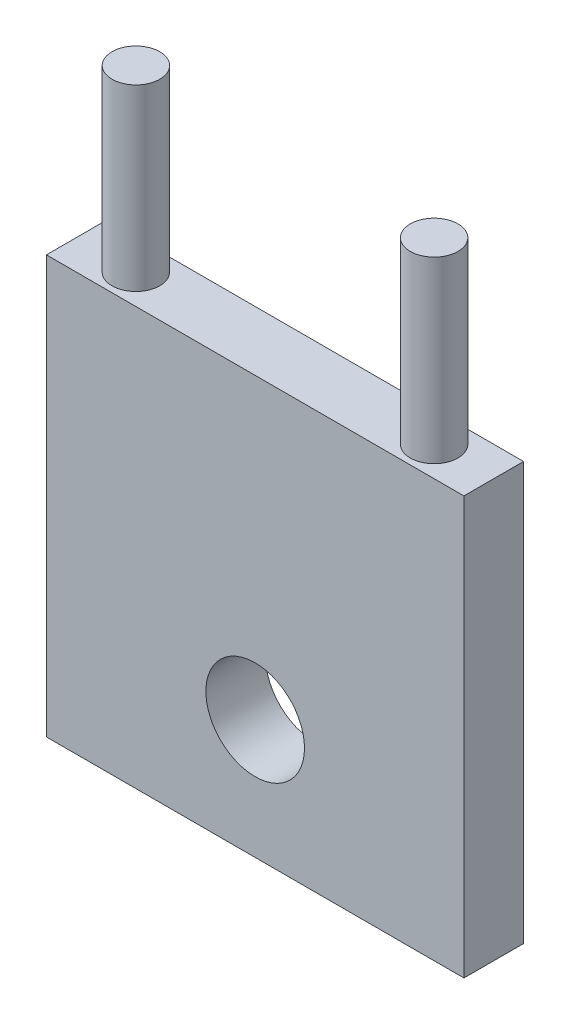
ISO-10303-21;
HEADER;
FILE_DESCRIPTION(('STEP AP214'),'2;1');
FILE_NAME('part.step','',(''),(''),'','','');
FILE_SCHEMA(('AUTOMOTIVE_DESIGN { 1 0 10303 214 1 1 1 1 }'));
ENDSEC;
DATA;
#1=APPLICATION_CONTEXT('core data for automotive mechanical design processes');
#2=APPLICATION_PROTOCOL_DEFINITION('international standard','automotive_design',2000,#1);
#3=PRODUCT_CONTEXT('',#1,'mechanical');
#4=PRODUCT('Part','Part','',(#3));
#5=PRODUCT_RELATED_PRODUCT_CATEGORY('part','',(#4));
#6=PRODUCT_DEFINITION_FORMATION('','',#4);
#7=PRODUCT_DEFINITION_CONTEXT('part definition',#1,'design');
#8=PRODUCT_DEFINITION('design','',#6,#7);
#9=PRODUCT_DEFINITION_SHAPE('','',#8);
#10=(LENGTH_UNIT() NAMED_UNIT(*) SI_UNIT(.MILLI.,.METRE.));
#11=(NAMED_UNIT(*) PLANE_ANGLE_UNIT() SI_UNIT($,.RADIAN.));
#12=(NAMED_UNIT(*) SI_UNIT($,.STERADIAN.) SOLID_ANGLE_UNIT());
#13=UNCERTAINTY_MEASURE_WITH_UNIT(LENGTH_MEASURE(1.E-05),#10,'distance_accuracy_value','');
#14=(GEOMETRIC_REPRESENTATION_CONTEXT(3) GLOBAL_UNCERTAINTY_ASSIGNED_CONTEXT((#13)) GLOBAL_UNIT_ASSIGNED_CONTEXT((#10,
#11,#12)) REPRESENTATION_CONTEXT('',''));
#15=CARTESIAN_POINT('',(0.,0.,0.));
#16=DIRECTION('',(0.,0.,1.));
#17=DIRECTION('',(1.,0.,0.));
#18=AXIS2_PLACEMENT_3D('',#15,#16,#17);
#19=CARTESIAN_POINT('',(17.78,0.,-2.54));
#20=DIRECTION('',(0.,-1.,0.));
#21=DIRECTION('',(1.,0.,0.));
#22=AXIS2_PLACEMENT_3D('',#19,#20,#21);
#23=PLANE('',#22);
#24=DIRECTION('',(1.,0.,0.));
#25=VECTOR('',#24,1.);
#26=CARTESIAN_POINT('',(17.78,0.,0.));
#27=LINE('',#26,#25);
#28=CARTESIAN_POINT('',(0.,0.,0.));
#29=VERTEX_POINT('',#28);
#30=CARTESIAN_POINT('',(17.78,0.,0.));
#31=VERTEX_POINT('',#30);
#32=EDGE_CURVE('E98',#29,#31,#27,.T.);
#33=ORIENTED_EDGE('',*,*,#32,.F.);
#34=DIRECTION('',(0.,0.,1.));
#35=VECTOR('',#34,1.);
#36=CARTESIAN_POINT('',(0.,0.,-2.54));
#37=LINE('',#36,#35);
#38=CARTESIAN_POINT('',(0.,0.,-2.54));
#39=VERTEX_POINT('',#38);
#40=EDGE_CURVE('E11',#39,#29,#37,.T.);
#41=ORIENTED_EDGE('',*,*,#40,.F.);
#42=DIRECTION('',(1.,0.,0.));
#43=VECTOR('',#42,1.);
#44=CARTESIAN_POINT('',(17.78,0.,-2.54));
#45=LINE('',#44,#43);
#46=CARTESIAN_POINT('',(17.78,0.,-2.54));
#47=VERTEX_POINT('',#46);
#48=EDGE_CURVE('E91',#39,#47,#45,.T.);
#49=ORIENTED_EDGE('',*,*,#48,.T.);
#50=DIRECTION('',(0.,0.,1.));
#51=VECTOR('',#50,1.);
#52=CARTESIAN_POINT('',(17.78,0.,-2.54));
#53=LINE('',#52,#51);
#54=EDGE_CURVE('E36',#47,#31,#53,.T.);
#55=ORIENTED_EDGE('',*,*,#54,.T.);
#56=EDGE_LOOP('',(#33,#41,#49,#55));
#57=FACE_BOUND('',#56,.T.);
#58=ADVANCED_FACE('F33',(#57),#23,.T.);
#59=CARTESIAN_POINT('',(0.,0.,-2.54));
#60=DIRECTION('',(-1.,0.,0.));
#61=DIRECTION('',(0.,0.,1.));
#62=AXIS2_PLACEMENT_3D('',#59,#60,#61);
#63=PLANE('',#62);
#64=DIRECTION('',(0.,-1.,0.));
#65=VECTOR('',#64,1.);
#66=CARTESIAN_POINT('',(0.,0.,0.));
#67=LINE('',#66,#65);
#68=CARTESIAN_POINT('',(0.,17.78,0.));
#69=VERTEX_POINT('',#68);
#70=EDGE_CURVE('E93',#69,#29,#67,.T.);
#71=ORIENTED_EDGE('',*,*,#70,.F.);
#72=DIRECTION('',(0.,0.,1.));
#73=VECTOR('',#72,1.);
#74=CARTESIAN_POINT('',(0.,17.78,-2.54));
#75=LINE('',#74,#73);
#76=CARTESIAN_POINT('',(0.,17.78,-2.54));
#77=VERTEX_POINT('',#76);
#78=EDGE_CURVE('E42',#77,#69,#75,.T.);
#79=ORIENTED_EDGE('',*,*,#78,.F.);
#80=DIRECTION('',(0.,-1.,0.));
#81=VECTOR('',#80,1.);
#82=CARTESIAN_POINT('',(0.,0.,-2.54));
#83=LINE('',#82,#81);
#84=EDGE_CURVE('E88',#77,#39,#83,.T.);
#85=ORIENTED_EDGE('',*,*,#84,.T.);
#86=ORIENTED_EDGE('',*,*,#40,.T.);
#87=EDGE_LOOP('',(#71,#79,#85,#86));
#88=FACE_BOUND('',#87,.T.);
#89=ADVANCED_FACE('F109',(#88),#63,.T.);
#90=CARTESIAN_POINT('',(0.,17.78,-2.54));
#91=DIRECTION('',(0.,1.,0.));
#92=DIRECTION('',(0.,0.,1.));
#93=AXIS2_PLACEMENT_3D('',#90,#91,#92);
#94=PLANE('',#93);
#95=CARTESIAN_POINT('',(15.24,17.78,-1.27));
#96=DIRECTION('',(0.,1.,0.));
#97=DIRECTION('',(0.,0.,1.));
#98=AXIS2_PLACEMENT_3D('',#95,#96,#97);
#99=CIRCLE('',#98,1.016);
#100=CARTESIAN_POINT('',(15.24,17.78,-2.286));
#101=VERTEX_POINT('',#100);
#102=EDGE_CURVE('E156',#101,#101,#99,.T.);
#103=ORIENTED_EDGE('',*,*,#102,.F.);
#104=EDGE_LOOP('',(#103));
#105=FACE_BOUND('',#104,.T.);
#106=CARTESIAN_POINT('',(2.54,17.78,-1.27));
#107=DIRECTION('',(0.,1.,0.));
#108=DIRECTION('',(0.,0.,1.));
#109=AXIS2_PLACEMENT_3D('',#106,#107,#108);
#110=CIRCLE('',#109,1.016);
#111=CARTESIAN_POINT('',(2.54,17.78,-2.286));
#112=VERTEX_POINT('',#111);
#113=EDGE_CURVE('E155',#112,#112,#110,.T.);
#114=ORIENTED_EDGE('',*,*,#113,.F.);
#115=EDGE_LOOP('',(#114));
#116=FACE_BOUND('',#115,.T.);
#117=DIRECTION('',(-1.,0.,0.));
#118=VECTOR('',#117,1.);
#119=CARTESIAN_POINT('',(0.,17.78,0.));
#120=LINE('',#119,#118);
#121=CARTESIAN_POINT('',(17.78,17.78,0.));
#122=VERTEX_POINT('',#121);
#123=EDGE_CURVE('E83',#122,#69,#120,.T.);
#124=ORIENTED_EDGE('',*,*,#123,.F.);
#125=DIRECTION('',(0.,0.,1.));
#126=VECTOR('',#125,1.);
#127=CARTESIAN_POINT('',(17.78,17.78,-2.54));
#128=LINE('',#127,#126);
#129=CARTESIAN_POINT('',(17.78,17.78,-2.54));
#130=VERTEX_POINT('',#129);
#131=EDGE_CURVE('E78',#130,#122,#128,.T.);
#132=ORIENTED_EDGE('',*,*,#131,.F.);
#133=DIRECTION('',(-1.,0.,0.));
#134=VECTOR('',#133,1.);
#135=CARTESIAN_POINT('',(0.,17.78,-2.54));
#136=LINE('',#135,#134);
#137=EDGE_CURVE('E81',#130,#77,#136,.T.);
#138=ORIENTED_EDGE('',*,*,#137,.T.);
#139=ORIENTED_EDGE('',*,*,#78,.T.);
#140=EDGE_LOOP('',(#124,#132,#138,#139));
#141=FACE_BOUND('',#140,.T.);
#142=ADVANCED_FACE('F80',(#105,#116,#141),#94,.T.);
#143=CARTESIAN_POINT('',(17.78,17.78,-2.54));
#144=DIRECTION('',(1.,0.,0.));
#145=DIRECTION('',(0.,1.,0.));
#146=AXIS2_PLACEMENT_3D('',#143,#144,#145);
#147=PLANE('',#146);
#148=DIRECTION('',(0.,1.,0.));
#149=VECTOR('',#148,1.);
#150=CARTESIAN_POINT('',(17.78,17.78,0.));
#151=LINE('',#150,#149);
#152=EDGE_CURVE('E101',#31,#122,#151,.T.);
#153=ORIENTED_EDGE('',*,*,#152,.F.);
#154=ORIENTED_EDGE('',*,*,#54,.F.);
#155=DIRECTION('',(0.,1.,0.));
#156=VECTOR('',#155,1.);
#157=CARTESIAN_POINT('',(17.78,17.78,-2.54));
#158=LINE('',#157,#156);
#159=EDGE_CURVE('E87',#47,#130,#158,.T.);
#160=ORIENTED_EDGE('',*,*,#159,.T.);
#161=ORIENTED_EDGE('',*,*,#131,.T.);
#162=EDGE_LOOP('',(#153,#154,#160,#161));
#163=FACE_BOUND('',#162,.T.);
#164=ADVANCED_FACE('F90',(#163),#147,.T.);
#165=CARTESIAN_POINT('',(0.,0.,-2.54));
#166=DIRECTION('',(0.,0.,-1.));
#167=DIRECTION('',(-1.,0.,0.));
#168=AXIS2_PLACEMENT_3D('',#165,#166,#167);
#169=PLANE('',#168);
#170=CARTESIAN_POINT('',(8.89,5.08,-2.54));
#171=DIRECTION('',(0.,0.,1.));
#172=DIRECTION('',(1.,0.,0.));
#173=AXIS2_PLACEMENT_3D('',#170,#171,#172);
#174=CIRCLE('',#173,2.0999958);
#175=CARTESIAN_POINT('',(10.9899958,5.08,-2.54));
#176=VERTEX_POINT('',#175);
#177=EDGE_CURVE('E102',#176,#176,#174,.T.);
#178=ORIENTED_EDGE('',*,*,#177,.T.);
#179=EDGE_LOOP('',(#178));
#180=FACE_BOUND('',#179,.T.);
#181=ORIENTED_EDGE('',*,*,#48,.F.);
#182=ORIENTED_EDGE('',*,*,#84,.F.);
#183=ORIENTED_EDGE('',*,*,#137,.F.);
#184=ORIENTED_EDGE('',*,*,#159,.F.);
#185=EDGE_LOOP('',(#181,#182,#183,#184));
#186=FACE_BOUND('',#185,.T.);
#187=ADVANCED_FACE('F86',(#180,#186),#169,.T.);
#188=CARTESIAN_POINT('',(0.,0.,0.));
#189=DIRECTION('',(0.,0.,-1.));
#190=DIRECTION('',(-1.,0.,0.));
#191=AXIS2_PLACEMENT_3D('',#188,#189,#190);
#192=PLANE('',#191);
#193=CARTESIAN_POINT('',(8.89,5.08,0.));
#194=DIRECTION('',(0.,0.,1.));
#195=DIRECTION('',(1.,0.,0.));
#196=AXIS2_PLACEMENT_3D('',#193,#194,#195);
#197=CIRCLE('',#196,2.0999958);
#198=CARTESIAN_POINT('',(10.9899958,5.08,0.));
#199=VERTEX_POINT('',#198);
#200=EDGE_CURVE('E165',#199,#199,#197,.T.);
#201=ORIENTED_EDGE('',*,*,#200,.F.);
#202=EDGE_LOOP('',(#201));
#203=FACE_BOUND('',#202,.T.);
#204=ORIENTED_EDGE('',*,*,#32,.T.);
#205=ORIENTED_EDGE('',*,*,#152,.T.);
#206=ORIENTED_EDGE('',*,*,#123,.T.);
#207=ORIENTED_EDGE('',*,*,#70,.T.);
#208=EDGE_LOOP('',(#204,#205,#206,#207));
#209=FACE_BOUND('',#208,.T.);
#210=ADVANCED_FACE('F108',(#203,#209),#192,.F.);
#211=CARTESIAN_POINT('',(8.89,5.08,-2.54));
#212=DIRECTION('',(0.,0.,1.));
#213=DIRECTION('',(1.,0.,0.));
#214=AXIS2_PLACEMENT_3D('',#211,#212,#213);
#215=CYLINDRICAL_SURFACE('',#214,2.0999958);
#216=ORIENTED_EDGE('',*,*,#177,.F.);
#217=EDGE_LOOP('',(#216));
#218=FACE_BOUND('',#217,.T.);
#219=ORIENTED_EDGE('',*,*,#200,.T.);
#220=EDGE_LOOP('',(#219));
#221=FACE_BOUND('',#220,.T.);
#222=ADVANCED_FACE('F128',(#218,#221),#215,.F.);
#223=CARTESIAN_POINT('',(2.54,25.4,-1.27));
#224=DIRECTION('',(0.,-1.,0.));
#225=DIRECTION('',(0.,0.,-1.));
#226=AXIS2_PLACEMENT_3D('',#223,#224,#225);
#227=CYLINDRICAL_SURFACE('',#226,1.016);
#228=CARTESIAN_POINT('',(2.54,25.4,-1.27));
#229=DIRECTION('',(0.,1.,0.));
#230=DIRECTION('',(0.,0.,1.));
#231=AXIS2_PLACEMENT_3D('',#228,#229,#230);
#232=CIRCLE('',#231,1.016);
#233=CARTESIAN_POINT('',(2.54,25.4,-2.286));
#234=VERTEX_POINT('',#233);
#235=EDGE_CURVE('E159',#234,#234,#232,.T.);
#236=CARTESIAN_POINT('',(2.54,25.4,-2.286));
#237=CARTESIAN_POINT('',(2.54,25.320625,-2.286));
#238=CARTESIAN_POINT('',(2.54,25.24125,-2.286));
#239=CARTESIAN_POINT('',(2.54,25.0825,-2.286));
#240=CARTESIAN_POINT('',(2.54,25.003125,-2.286));
#241=CARTESIAN_POINT('',(2.54,24.844375,-2.286));
#242=CARTESIAN_POINT('',(2.54,24.765,-2.286));
#243=CARTESIAN_POINT('',(2.54,24.60625,-2.286));
#244=CARTESIAN_POINT('',(2.54,24.526875,-2.286));
#245=CARTESIAN_POINT('',(2.54,24.368125,-2.286));
#246=CARTESIAN_POINT('',(2.54,24.28875,-2.286));
#247=CARTESIAN_POINT('',(2.54,24.13,-2.286));
#248=CARTESIAN_POINT('',(2.54,24.050625,-2.286));
#249=CARTESIAN_POINT('',(2.54,23.891875,-2.286));
#250=CARTESIAN_POINT('',(2.54,23.8125,-2.286));
#251=CARTESIAN_POINT('',(2.54,23.65375,-2.286));
#252=CARTESIAN_POINT('',(2.54,23.574375,-2.286));
#253=CARTESIAN_POINT('',(2.54,23.415625,-2.286));
#254=CARTESIAN_POINT('',(2.54,23.33625,-2.286));
#255=CARTESIAN_POINT('',(2.54,23.1775,-2.286));
#256=CARTESIAN_POINT('',(2.54,23.098125,-2.286));
#257=CARTESIAN_POINT('',(2.54,22.939375,-2.286));
#258=CARTESIAN_POINT('',(2.54,22.86,-2.286));
#259=CARTESIAN_POINT('',(2.54,22.70125,-2.286));
#260=CARTESIAN_POINT('',(2.54,22.621875,-2.286));
#261=CARTESIAN_POINT('',(2.54,22.463125,-2.286));
#262=CARTESIAN_POINT('',(2.54,22.38375,-2.286));
#263=CARTESIAN_POINT('',(2.54,22.225,-2.286));
#264=CARTESIAN_POINT('',(2.54,22.145625,-2.286));
#265=CARTESIAN_POINT('',(2.54,21.986875,-2.286));
#266=CARTESIAN_POINT('',(2.54,21.9075,-2.286));
#267=CARTESIAN_POINT('',(2.54,21.74875,-2.286));
#268=CARTESIAN_POINT('',(2.54,21.669375,-2.286));
#269=CARTESIAN_POINT('',(2.54,21.510625,-2.286));
#270=CARTESIAN_POINT('',(2.54,21.43125,-2.286));
#271=CARTESIAN_POINT('',(2.54,21.2725,-2.286));
#272=CARTESIAN_POINT('',(2.54,21.193125,-2.286));
#273=CARTESIAN_POINT('',(2.54,21.034375,-2.286));
#274=CARTESIAN_POINT('',(2.54,20.955,-2.286));
#275=CARTESIAN_POINT('',(2.54,20.79625,-2.286));
#276=CARTESIAN_POINT('',(2.54,20.716875,-2.286));
#277=CARTESIAN_POINT('',(2.54,20.558125,-2.286));
#278=CARTESIAN_POINT('',(2.54,20.47875,-2.286));
#279=CARTESIAN_POINT('',(2.54,20.32,-2.286));
#280=CARTESIAN_POINT('',(2.54,20.240625,-2.286));
#281=CARTESIAN_POINT('',(2.54,20.081875,-2.286));
#282=CARTESIAN_POINT('',(2.54,20.0025,-2.286));
#283=CARTESIAN_POINT('',(2.54,19.84375,-2.286));
#284=CARTESIAN_POINT('',(2.54,19.764375,-2.286));
#285=CARTESIAN_POINT('',(2.54,19.605625,-2.286));
#286=CARTESIAN_POINT('',(2.54,19.52625,-2.286));
#287=CARTESIAN_POINT('',(2.54,19.3675,-2.286));
#288=CARTESIAN_POINT('',(2.54,19.288125,-2.286));
#289=CARTESIAN_POINT('',(2.54,19.129375,-2.286));
#290=CARTESIAN_POINT('',(2.54,19.05,-2.286));
#291=CARTESIAN_POINT('',(2.54,18.89125,-2.286));
#292=CARTESIAN_POINT('',(2.54,18.811875,-2.286));
#293=CARTESIAN_POINT('',(2.54,18.653125,-2.286));
#294=CARTESIAN_POINT('',(2.54,18.57375,-2.286));
#295=CARTESIAN_POINT('',(2.54,18.415,-2.286));
#296=CARTESIAN_POINT('',(2.54,18.335625,-2.286));
#297=CARTESIAN_POINT('',(2.54,18.176875,-2.286));
#298=CARTESIAN_POINT('',(2.54,18.0975,-2.286));
#299=CARTESIAN_POINT('',(2.54,17.93875,-2.286));
#300=CARTESIAN_POINT('',(2.54,17.859375,-2.286));
#301=CARTESIAN_POINT('',(2.54,17.78,-2.286));
#302=B_SPLINE_CURVE_WITH_KNOTS('',3,(#236,#237,#238,#239,#240,#241,#242,#243,#244,#245,#246,
#247,#248,#249,#250,#251,#252,#253,#254,#255,#256,#257,#258,#259,#260,#261,#262,#263,#264,#265,
#266,#267,#268,#269,#270,#271,#272,#273,#274,#275,#276,#277,#278,#279,#280,#281,#282,#283,#284,
#285,#286,#287,#288,#289,#290,#291,#292,#293,#294,#295,#296,#297,#298,#299,#300,#301),
.UNSPECIFIED.,.F.,.F.,(4,2,2,2,2,2,2,2,2,2,2,2,2,2,2,2,2,2,2,2,2,2,2,2,2,2,2,2,2,2,2,2,4),(0.,
0.238125000000002,0.476250000000001,0.714375000000003,0.952500000000002,1.190625,1.42875,
1.666875,1.905,2.143125,2.38125,2.619375,2.8575,3.095625,3.33375,3.571875,3.81,4.048125,4.28625,
4.524375,4.7625,5.000625,5.23875,5.476875,5.715,5.953125,6.19125,6.429375,6.6675,6.905625,
7.14375,7.381875,7.62),.UNSPECIFIED.);
#303=EDGE_CURVE('BSEAM134',#234,#112,#302,.T.);
#304=ORIENTED_EDGE('',*,*,#235,.F.);
#305=ORIENTED_EDGE('',*,*,#113,.T.);
#306=ORIENTED_EDGE('',*,*,#303,.T.);
#307=ORIENTED_EDGE('',*,*,#303,.F.);
#308=EDGE_LOOP('',(#304,#306,#305,#307));
#309=FACE_BOUND('',#308,.T.);
#310=ADVANCED_FACE('F134',(#309),#227,.T.);
#311=CARTESIAN_POINT('',(2.54,25.4,-1.27));
#312=DIRECTION('',(0.,1.,0.));
#313=DIRECTION('',(0.,0.,1.));
#314=AXIS2_PLACEMENT_3D('',#311,#312,#313);
#315=PLANE('',#314);
#316=ORIENTED_EDGE('',*,*,#235,.T.);
#317=EDGE_LOOP('',(#316));
#318=FACE_BOUND('',#317,.T.);
#319=ADVANCED_FACE('F138',(#318),#315,.T.);
#320=CARTESIAN_POINT('',(15.24,25.4,-1.27));
#321=DIRECTION('',(0.,-1.,0.));
#322=DIRECTION('',(0.,0.,-1.));
#323=AXIS2_PLACEMENT_3D('',#320,#321,#322);
#324=CYLINDRICAL_SURFACE('',#323,1.016);
#325=CARTESIAN_POINT('',(15.24,25.4,-1.27));
#326=DIRECTION('',(0.,1.,0.));
#327=DIRECTION('',(0.,0.,1.));
#328=AXIS2_PLACEMENT_3D('',#325,#326,#327);
#329=CIRCLE('',#328,1.016);
#330=CARTESIAN_POINT('',(15.24,25.4,-2.286));
#331=VERTEX_POINT('',#330);
#332=EDGE_CURVE('E154',#331,#331,#329,.T.);
#333=CARTESIAN_POINT('',(15.24,25.4,-2.286));
#334=CARTESIAN_POINT('',(15.24,25.320625,-2.286));
#335=CARTESIAN_POINT('',(15.24,25.24125,-2.286));
#336=CARTESIAN_POINT('',(15.24,25.0825,-2.286));
#337=CARTESIAN_POINT('',(15.24,25.003125,-2.286));
#338=CARTESIAN_POINT('',(15.24,24.844375,-2.286));
#339=CARTESIAN_POINT('',(15.24,24.765,-2.286));
#340=CARTESIAN_POINT('',(15.24,24.60625,-2.286));
#341=CARTESIAN_POINT('',(15.24,24.526875,-2.286));
#342=CARTESIAN_POINT('',(15.24,24.368125,-2.286));
#343=CARTESIAN_POINT('',(15.24,24.28875,-2.286));
#344=CARTESIAN_POINT('',(15.24,24.13,-2.286));
#345=CARTESIAN_POINT('',(15.24,24.050625,-2.286));
#346=CARTESIAN_POINT('',(15.24,23.891875,-2.286));
#347=CARTESIAN_POINT('',(15.24,23.8125,-2.286));
#348=CARTESIAN_POINT('',(15.24,23.65375,-2.286));
#349=CARTESIAN_POINT('',(15.24,23.574375,-2.286));
#350=CARTESIAN_POINT('',(15.24,23.415625,-2.286));
#351=CARTESIAN_POINT('',(15.24,23.33625,-2.286));
#352=CARTESIAN_POINT('',(15.24,23.1775,-2.286));
#353=CARTESIAN_POINT('',(15.24,23.098125,-2.286));
#354=CARTESIAN_POINT('',(15.24,22.939375,-2.286));
#355=CARTESIAN_POINT('',(15.24,22.86,-2.286));
#356=CARTESIAN_POINT('',(15.24,22.70125,-2.286));
#357=CARTESIAN_POINT('',(15.24,22.621875,-2.286));
#358=CARTESIAN_POINT('',(15.24,22.463125,-2.286));
#359=CARTESIAN_POINT('',(15.24,22.38375,-2.286));
#360=CARTESIAN_POINT('',(15.24,22.225,-2.286));
#361=CARTESIAN_POINT('',(15.24,22.145625,-2.286));
#362=CARTESIAN_POINT('',(15.24,21.986875,-2.286));
#363=CARTESIAN_POINT('',(15.24,21.9075,-2.286));
#364=CARTESIAN_POINT('',(15.24,21.74875,-2.286));
#365=CARTESIAN_POINT('',(15.24,21.669375,-2.286));
#366=CARTESIAN_POINT('',(15.24,21.510625,-2.286));
#367=CARTESIAN_POINT('',(15.24,21.43125,-2.286));
#368=CARTESIAN_POINT('',(15.24,21.2725,-2.286));
#369=CARTESIAN_POINT('',(15.24,21.193125,-2.286));
#370=CARTESIAN_POINT('',(15.24,21.034375,-2.286));
#371=CARTESIAN_POINT('',(15.24,20.955,-2.286));
#372=CARTESIAN_POINT('',(15.24,20.79625,-2.286));
#373=CARTESIAN_POINT('',(15.24,20.716875,-2.286));
#374=CARTESIAN_POINT('',(15.24,20.558125,-2.286));
#375=CARTESIAN_POINT('',(15.24,20.47875,-2.286));
#376=CARTESIAN_POINT('',(15.24,20.32,-2.286));
#377=CARTESIAN_POINT('',(15.24,20.240625,-2.286));
#378=CARTESIAN_POINT('',(15.24,20.081875,-2.286));
#379=CARTESIAN_POINT('',(15.24,20.0025,-2.286));
#380=CARTESIAN_POINT('',(15.24,19.84375,-2.286));
#381=CARTESIAN_POINT('',(15.24,19.764375,-2.286));
#382=CARTESIAN_POINT('',(15.24,19.605625,-2.286));
#383=CARTESIAN_POINT('',(15.24,19.52625,-2.286));
#384=CARTESIAN_POINT('',(15.24,19.3675,-2.286));
#385=CARTESIAN_POINT('',(15.24,19.288125,-2.286));
#386=CARTESIAN_POINT('',(15.24,19.129375,-2.286));
#387=CARTESIAN_POINT('',(15.24,19.05,-2.286));
#388=CARTESIAN_POINT('',(15.24,18.89125,-2.286));
#389=CARTESIAN_POINT('',(15.24,18.811875,-2.286));
#390=CARTESIAN_POINT('',(15.24,18.653125,-2.286));
#391=CARTESIAN_POINT('',(15.24,18.57375,-2.286));
#392=CARTESIAN_POINT('',(15.24,18.415,-2.286));
#393=CARTESIAN_POINT('',(15.24,18.335625,-2.286));
#394=CARTESIAN_POINT('',(15.24,18.176875,-2.286));
#395=CARTESIAN_POINT('',(15.24,18.0975,-2.286));
#396=CARTESIAN_POINT('',(15.24,17.93875,-2.286));
#397=CARTESIAN_POINT('',(15.24,17.859375,-2.286));
#398=CARTESIAN_POINT('',(15.24,17.78,-2.286));
#399=B_SPLINE_CURVE_WITH_KNOTS('',3,(#333,#334,#335,#336,#337,#338,#339,#340,#341,#342,#343,
#344,#345,#346,#347,#348,#349,#350,#351,#352,#353,#354,#355,#356,#357,#358,#359,#360,#361,#362,
#363,#364,#365,#366,#367,#368,#369,#370,#371,#372,#373,#374,#375,#376,#377,#378,#379,#380,#381,
#382,#383,#384,#385,#386,#387,#388,#389,#390,#391,#392,#393,#394,#395,#396,#397,#398),
.UNSPECIFIED.,.F.,.F.,(4,2,2,2,2,2,2,2,2,2,2,2,2,2,2,2,2,2,2,2,2,2,2,2,2,2,2,2,2,2,2,2,4),(0.,
0.238125000000002,0.476250000000001,0.714375000000003,0.952500000000002,1.190625,1.42875,
1.666875,1.905,2.143125,2.38125,2.619375,2.8575,3.095625,3.33375,3.571875,3.81,4.048125,4.28625,
4.524375,4.7625,5.000625,5.23875,5.476875,5.715,5.953125,6.19125,6.429375,6.6675,6.905625,
7.14375,7.381875,7.62),.UNSPECIFIED.);
#400=EDGE_CURVE('BSEAM142',#331,#101,#399,.T.);
#401=ORIENTED_EDGE('',*,*,#332,.F.);
#402=ORIENTED_EDGE('',*,*,#102,.T.);
#403=ORIENTED_EDGE('',*,*,#400,.T.);
#404=ORIENTED_EDGE('',*,*,#400,.F.);
#405=EDGE_LOOP('',(#401,#403,#402,#404));
#406=FACE_BOUND('',#405,.T.);
#407=ADVANCED_FACE('F142',(#406),#324,.T.);
#408=CARTESIAN_POINT('',(15.24,25.4,-1.27));
#409=DIRECTION('',(0.,1.,0.));
#410=DIRECTION('',(0.,0.,1.));
#411=AXIS2_PLACEMENT_3D('',#408,#409,#410);
#412=PLANE('',#411);
#413=ORIENTED_EDGE('',*,*,#332,.T.);
#414=EDGE_LOOP('',(#413));
#415=FACE_BOUND('',#414,.T.);
#416=ADVANCED_FACE('F146',(#415),#412,.T.);
#417=CLOSED_SHELL('',(#58,#89,#142,#164,#187,#210,#222,#310,#319,#407,#416));
#418=MANIFOLD_SOLID_BREP('B2',#417);
#419=ADVANCED_BREP_SHAPE_REPRESENTATION('',(#18,#418),#14);
#420=SHAPE_DEFINITION_REPRESENTATION(#9,#419);
ENDSEC;
END-ISO-10303-21;
